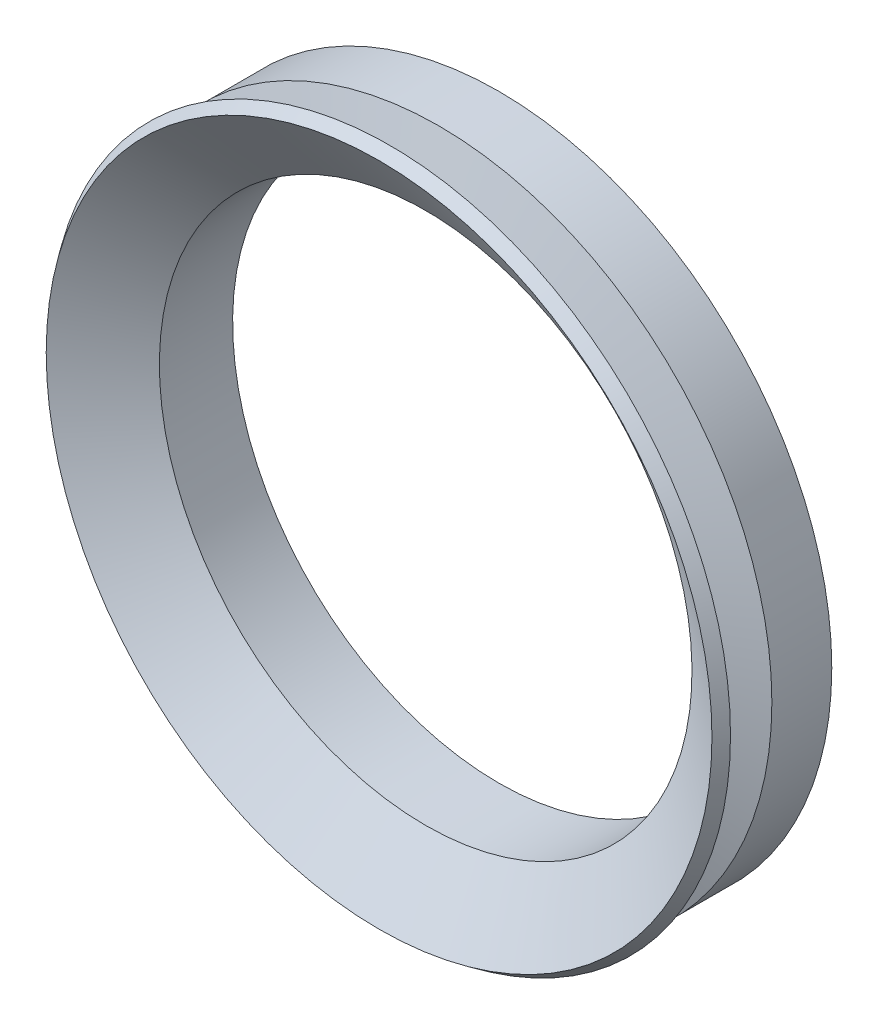
ISO-10303-21;
HEADER;
FILE_DESCRIPTION(('STEP AP214'),'2;1');
FILE_NAME('part.step','',(''),(''),'','','');
FILE_SCHEMA(('AUTOMOTIVE_DESIGN { 1 0 10303 214 1 1 1 1 }'));
ENDSEC;
DATA;
#1=APPLICATION_CONTEXT('core data for automotive mechanical design processes');
#2=APPLICATION_PROTOCOL_DEFINITION('international standard','automotive_design',2000,#1);
#3=PRODUCT_CONTEXT('',#1,'mechanical');
#4=PRODUCT('Part','Part','',(#3));
#5=PRODUCT_RELATED_PRODUCT_CATEGORY('part','',(#4));
#6=PRODUCT_DEFINITION_FORMATION('','',#4);
#7=PRODUCT_DEFINITION_CONTEXT('part definition',#1,'design');
#8=PRODUCT_DEFINITION('design','',#6,#7);
#9=PRODUCT_DEFINITION_SHAPE('','',#8);
#10=(LENGTH_UNIT() NAMED_UNIT(*) SI_UNIT(.MILLI.,.METRE.));
#11=(NAMED_UNIT(*) PLANE_ANGLE_UNIT() SI_UNIT($,.RADIAN.));
#12=(NAMED_UNIT(*) SI_UNIT($,.STERADIAN.) SOLID_ANGLE_UNIT());
#13=UNCERTAINTY_MEASURE_WITH_UNIT(LENGTH_MEASURE(1.E-05),#10,'distance_accuracy_value','');
#14=(GEOMETRIC_REPRESENTATION_CONTEXT(3) GLOBAL_UNCERTAINTY_ASSIGNED_CONTEXT((#13)) GLOBAL_UNIT_ASSIGNED_CONTEXT((#10,
#11,#12)) REPRESENTATION_CONTEXT('',''));
#15=CARTESIAN_POINT('',(0.,0.,0.));
#16=DIRECTION('',(0.,0.,1.));
#17=DIRECTION('',(1.,0.,0.));
#18=AXIS2_PLACEMENT_3D('',#15,#16,#17);
#19=CARTESIAN_POINT('',(-62.6618476114883,-361.310072168843,-378.554331920519));
#20=DIRECTION('',(0.,0.,-1.));
#21=DIRECTION('',(-1.,0.,0.));
#22=AXIS2_PLACEMENT_3D('',#19,#20,#21);
#23=CONICAL_SURFACE('',#22,25.5734623443633,0.610725964389215);
#24=CARTESIAN_POINT('',(-62.6618476114883,-361.310072168843,-377.7351));
#25=DIRECTION('',(0.,0.,1.));
#26=DIRECTION('',(-1.,0.,0.));
#27=AXIS2_PLACEMENT_3D('',#24,#25,#26);
#28=CIRCLE('',#27,25.);
#29=CARTESIAN_POINT('',(-87.6618476114883,-361.310072168843,-377.7351));
#30=VERTEX_POINT('',#29);
#31=EDGE_CURVE('E34',#30,#30,#28,.F.);
#32=ORIENTED_EDGE('',*,*,#31,.T.);
#33=EDGE_LOOP('',(#32));
#34=FACE_BOUND('',#33,.T.);
#35=CARTESIAN_POINT('',(-62.6618476114883,-361.310072168843,-378.554331920519));
#36=DIRECTION('',(0.,0.,1.));
#37=DIRECTION('',(-1.,0.,0.));
#38=AXIS2_PLACEMENT_3D('',#35,#36,#37);
#39=CIRCLE('',#38,25.5734623443634);
#40=CARTESIAN_POINT('',(-88.2353099558517,-361.310072168843,-378.554331920519));
#41=VERTEX_POINT('',#40);
#42=EDGE_CURVE('E31',#41,#41,#39,.F.);
#43=ORIENTED_EDGE('',*,*,#42,.F.);
#44=EDGE_LOOP('',(#43));
#45=FACE_BOUND('',#44,.T.);
#46=ADVANCED_FACE('F15',(#34,#45),#23,.T.);
#47=CARTESIAN_POINT('',(-62.6618476114883,-361.310072168843,-378.554331920519));
#48=DIRECTION('',(0.,0.,1.));
#49=DIRECTION('',(0.,-1.,0.));
#50=AXIS2_PLACEMENT_3D('',#47,#48,#49);
#51=CONICAL_SURFACE('',#50,25.5734623443634,0.96007036240569);
#52=ORIENTED_EDGE('',*,*,#42,.T.);
#53=EDGE_LOOP('',(#52));
#54=FACE_BOUND('',#53,.T.);
#55=CARTESIAN_POINT('',(-62.6618476114883,-361.310072168843,-381.2351));
#56=DIRECTION('',(0.,0.,-1.));
#57=DIRECTION('',(1.,0.,0.));
#58=AXIS2_PLACEMENT_3D('',#55,#56,#57);
#59=CIRCLE('',#58,21.7437936593906);
#60=CARTESIAN_POINT('',(-40.9180539520977,-361.310072168843,-381.2351));
#61=VERTEX_POINT('',#60);
#62=EDGE_CURVE('E38',#61,#61,#59,.T.);
#63=ORIENTED_EDGE('',*,*,#62,.F.);
#64=EDGE_LOOP('',(#63));
#65=FACE_BOUND('',#64,.T.);
#66=ADVANCED_FACE('F64',(#54,#65),#51,.T.);
#67=CARTESIAN_POINT('',(-62.6618476114883,-361.310072168843,-377.7351));
#68=DIRECTION('',(0.,0.,1.));
#69=DIRECTION('',(1.,0.,0.));
#70=AXIS2_PLACEMENT_3D('',#67,#68,#69);
#71=CONICAL_SURFACE('',#70,25.,0.960070362405688);
#72=CARTESIAN_POINT('',(-62.6618476114883,-361.310072168843,-381.2351));
#73=DIRECTION('',(0.,0.,1.));
#74=DIRECTION('',(0.,-1.,0.));
#75=AXIS2_PLACEMENT_3D('',#72,#73,#74);
#76=CIRCLE('',#75,20.);
#77=CARTESIAN_POINT('',(-62.6618476114883,-381.310072168843,-381.2351));
#78=VERTEX_POINT('',#77);
#79=EDGE_CURVE('E42',#78,#78,#76,.F.);
#80=ORIENTED_EDGE('',*,*,#79,.T.);
#81=EDGE_LOOP('',(#80));
#82=FACE_BOUND('',#81,.T.);
#83=ORIENTED_EDGE('',*,*,#31,.F.);
#84=EDGE_LOOP('',(#83));
#85=FACE_BOUND('',#84,.T.);
#86=ADVANCED_FACE('F55',(#82,#85),#71,.F.);
#87=CARTESIAN_POINT('',(-62.6618476114883,-361.310072168843,-382.2351));
#88=DIRECTION('',(0.,0.,-1.));
#89=DIRECTION('',(0.,1.,0.));
#90=AXIS2_PLACEMENT_3D('',#87,#88,#89);
#91=CONICAL_SURFACE('',#90,25.,1.2728332250036);
#92=ORIENTED_EDGE('',*,*,#62,.T.);
#93=EDGE_LOOP('',(#92));
#94=FACE_BOUND('',#93,.T.);
#95=CARTESIAN_POINT('',(-62.6618476114883,-361.310072168843,-382.2351));
#96=DIRECTION('',(0.,0.,1.));
#97=DIRECTION('',(0.,-1.,0.));
#98=AXIS2_PLACEMENT_3D('',#95,#96,#97);
#99=CIRCLE('',#98,25.);
#100=CARTESIAN_POINT('',(-62.6618476114883,-386.310072168843,-382.2351));
#101=VERTEX_POINT('',#100);
#102=EDGE_CURVE('E29',#101,#101,#99,.F.);
#103=ORIENTED_EDGE('',*,*,#102,.F.);
#104=EDGE_LOOP('',(#103));
#105=FACE_BOUND('',#104,.T.);
#106=ADVANCED_FACE('F52',(#94,#105),#91,.T.);
#107=CARTESIAN_POINT('',(-62.6618476114883,-361.310072168843,-383.9851));
#108=DIRECTION('',(0.,0.,1.));
#109=DIRECTION('',(0.,-1.,0.));
#110=AXIS2_PLACEMENT_3D('',#107,#108,#109);
#111=CYLINDRICAL_SURFACE('',#110,20.);
#112=CARTESIAN_POINT('',(-62.6618476114883,-361.310072168843,-386.7351));
#113=DIRECTION('',(0.,0.,1.));
#114=DIRECTION('',(0.,-1.,0.));
#115=AXIS2_PLACEMENT_3D('',#112,#113,#114);
#116=CIRCLE('',#115,20.);
#117=CARTESIAN_POINT('',(-62.6618476114883,-381.310072168843,-386.7351));
#118=VERTEX_POINT('',#117);
#119=EDGE_CURVE('E18',#118,#118,#116,.F.);
#120=ORIENTED_EDGE('',*,*,#119,.T.);
#121=EDGE_LOOP('',(#120));
#122=FACE_BOUND('',#121,.T.);
#123=ORIENTED_EDGE('',*,*,#79,.F.);
#124=EDGE_LOOP('',(#123));
#125=FACE_BOUND('',#124,.T.);
#126=ADVANCED_FACE('F54',(#122,#125),#111,.F.);
#127=CARTESIAN_POINT('',(-62.6618476114883,-361.310072168843,-384.4851));
#128=DIRECTION('',(0.,0.,1.));
#129=DIRECTION('',(0.,-1.,0.));
#130=AXIS2_PLACEMENT_3D('',#127,#128,#129);
#131=CYLINDRICAL_SURFACE('',#130,25.);
#132=ORIENTED_EDGE('',*,*,#102,.T.);
#133=EDGE_LOOP('',(#132));
#134=FACE_BOUND('',#133,.T.);
#135=CARTESIAN_POINT('',(-62.6618476114883,-361.310072168843,-386.7351));
#136=DIRECTION('',(0.,0.,1.));
#137=DIRECTION('',(0.,-1.,0.));
#138=AXIS2_PLACEMENT_3D('',#135,#136,#137);
#139=CIRCLE('',#138,25.);
#140=CARTESIAN_POINT('',(-62.6618476114883,-386.310072168843,-386.7351));
#141=VERTEX_POINT('',#140);
#142=EDGE_CURVE('E10',#141,#141,#139,.T.);
#143=ORIENTED_EDGE('',*,*,#142,.T.);
#144=EDGE_LOOP('',(#143));
#145=FACE_BOUND('',#144,.T.);
#146=ADVANCED_FACE('F50',(#134,#145),#131,.T.);
#147=CARTESIAN_POINT('',(-40.1618476114883,-361.310072168843,-386.7351));
#148=DIRECTION('',(0.,0.,1.));
#149=DIRECTION('',(0.,-1.,0.));
#150=AXIS2_PLACEMENT_3D('',#147,#148,#149);
#151=PLANE('',#150);
#152=ORIENTED_EDGE('',*,*,#142,.F.);
#153=EDGE_LOOP('',(#152));
#154=FACE_BOUND('',#153,.T.);
#155=ORIENTED_EDGE('',*,*,#119,.F.);
#156=EDGE_LOOP('',(#155));
#157=FACE_BOUND('',#156,.T.);
#158=ADVANCED_FACE('F67',(#154,#157),#151,.F.);
#159=CLOSED_SHELL('',(#46,#66,#86,#106,#126,#146,#158));
#160=MANIFOLD_SOLID_BREP('B1',#159);
#161=ADVANCED_BREP_SHAPE_REPRESENTATION('',(#18,#160),#14);
#162=SHAPE_DEFINITION_REPRESENTATION(#9,#161);
ENDSEC;
END-ISO-10303-21;
